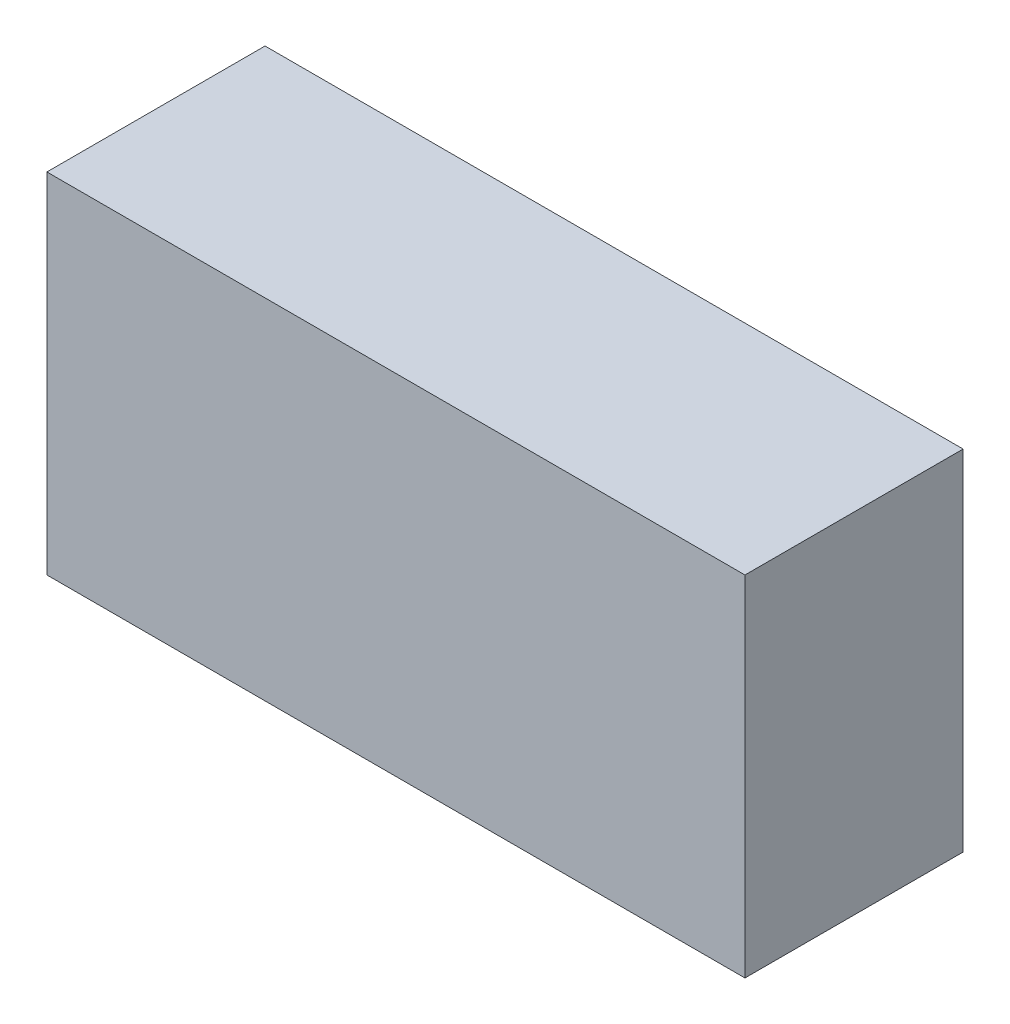
ISO-10303-21;
HEADER;
FILE_DESCRIPTION(('STEP AP214'),'2;1');
FILE_NAME('part.step','',(''),(''),'','','');
FILE_SCHEMA(('AUTOMOTIVE_DESIGN { 1 0 10303 214 1 1 1 1 }'));
ENDSEC;
DATA;
#1=APPLICATION_CONTEXT('core data for automotive mechanical design processes');
#2=APPLICATION_PROTOCOL_DEFINITION('international standard','automotive_design',2000,#1);
#3=PRODUCT_CONTEXT('',#1,'mechanical');
#4=PRODUCT('Part','Part','',(#3));
#5=PRODUCT_RELATED_PRODUCT_CATEGORY('part','',(#4));
#6=PRODUCT_DEFINITION_FORMATION('','',#4);
#7=PRODUCT_DEFINITION_CONTEXT('part definition',#1,'design');
#8=PRODUCT_DEFINITION('design','',#6,#7);
#9=PRODUCT_DEFINITION_SHAPE('','',#8);
#10=(LENGTH_UNIT() NAMED_UNIT(*) SI_UNIT(.MILLI.,.METRE.));
#11=(NAMED_UNIT(*) PLANE_ANGLE_UNIT() SI_UNIT($,.RADIAN.));
#12=(NAMED_UNIT(*) SI_UNIT($,.STERADIAN.) SOLID_ANGLE_UNIT());
#13=UNCERTAINTY_MEASURE_WITH_UNIT(LENGTH_MEASURE(1.E-05),#10,'distance_accuracy_value','');
#14=(GEOMETRIC_REPRESENTATION_CONTEXT(3) GLOBAL_UNCERTAINTY_ASSIGNED_CONTEXT((#13)) GLOBAL_UNIT_ASSIGNED_CONTEXT((#10,
#11,#12)) REPRESENTATION_CONTEXT('',''));
#15=CARTESIAN_POINT('',(0.,0.,0.));
#16=DIRECTION('',(0.,0.,1.));
#17=DIRECTION('',(1.,0.,0.));
#18=AXIS2_PLACEMENT_3D('',#15,#16,#17);
#19=CARTESIAN_POINT('',(0.80000094,-0.3999992,0.5));
#20=DIRECTION('',(0.,0.,-1.));
#21=DIRECTION('',(-1.,0.,0.));
#22=AXIS2_PLACEMENT_3D('',#19,#20,#21);
#23=PLANE('',#22);
#24=DIRECTION('',(1.,0.,0.));
#25=VECTOR('',#24,1.);
#26=CARTESIAN_POINT('',(0.80000094,0.3999992,0.5));
#27=LINE('',#26,#25);
#28=CARTESIAN_POINT('',(0.80000094,0.3999992,0.5));
#29=VERTEX_POINT('',#28);
#30=CARTESIAN_POINT('',(-0.80000094,0.3999992,0.5));
#31=VERTEX_POINT('',#30);
#32=EDGE_CURVE('E55',#29,#31,#27,.F.);
#33=ORIENTED_EDGE('',*,*,#32,.T.);
#34=DIRECTION('',(0.,1.,0.));
#35=VECTOR('',#34,1.);
#36=CARTESIAN_POINT('',(-0.80000094,0.3999992,0.5));
#37=LINE('',#36,#35);
#38=CARTESIAN_POINT('',(-0.80000094,-0.3999992,0.5));
#39=VERTEX_POINT('',#38);
#40=EDGE_CURVE('E58',#31,#39,#37,.F.);
#41=ORIENTED_EDGE('',*,*,#40,.T.);
#42=DIRECTION('',(1.,0.,0.));
#43=VECTOR('',#42,1.);
#44=CARTESIAN_POINT('',(-0.80000094,-0.3999992,0.5));
#45=LINE('',#44,#43);
#46=CARTESIAN_POINT('',(0.80000094,-0.3999992,0.5));
#47=VERTEX_POINT('',#46);
#48=EDGE_CURVE('E60',#39,#47,#45,.T.);
#49=ORIENTED_EDGE('',*,*,#48,.T.);
#50=DIRECTION('',(0.,1.,0.));
#51=VECTOR('',#50,1.);
#52=CARTESIAN_POINT('',(0.80000094,-0.3999992,0.5));
#53=LINE('',#52,#51);
#54=EDGE_CURVE('E20',#29,#47,#53,.F.);
#55=ORIENTED_EDGE('',*,*,#54,.F.);
#56=EDGE_LOOP('',(#33,#41,#49,#55));
#57=FACE_BOUND('',#56,.T.);
#58=ADVANCED_FACE('F17',(#57),#23,.F.);
#59=CARTESIAN_POINT('',(-0.80000094,-0.3999992,0.));
#60=DIRECTION('',(0.,1.,0.));
#61=DIRECTION('',(0.,0.,1.));
#62=AXIS2_PLACEMENT_3D('',#59,#60,#61);
#63=PLANE('',#62);
#64=DIRECTION('',(0.,0.,1.));
#65=VECTOR('',#64,1.);
#66=CARTESIAN_POINT('',(0.80000094,-0.3999992,0.));
#67=LINE('',#66,#65);
#68=CARTESIAN_POINT('',(0.80000094,-0.3999992,0.));
#69=VERTEX_POINT('',#68);
#70=EDGE_CURVE('E71',#69,#47,#67,.T.);
#71=ORIENTED_EDGE('',*,*,#70,.T.);
#72=ORIENTED_EDGE('',*,*,#48,.F.);
#73=DIRECTION('',(0.,0.,-1.));
#74=VECTOR('',#73,1.);
#75=CARTESIAN_POINT('',(-0.80000094,-0.3999992,0.));
#76=LINE('',#75,#74);
#77=CARTESIAN_POINT('',(-0.80000094,-0.3999992,0.));
#78=VERTEX_POINT('',#77);
#79=EDGE_CURVE('E65',#39,#78,#76,.T.);
#80=ORIENTED_EDGE('',*,*,#79,.T.);
#81=DIRECTION('',(-1.,0.,0.));
#82=VECTOR('',#81,1.);
#83=CARTESIAN_POINT('',(0.80000094,-0.3999992,0.));
#84=LINE('',#83,#82);
#85=EDGE_CURVE('E83',#69,#78,#84,.T.);
#86=ORIENTED_EDGE('',*,*,#85,.F.);
#87=EDGE_LOOP('',(#71,#72,#80,#86));
#88=FACE_BOUND('',#87,.T.);
#89=ADVANCED_FACE('F68',(#88),#63,.F.);
#90=CARTESIAN_POINT('',(-0.80000094,0.3999992,0.));
#91=DIRECTION('',(1.,0.,0.));
#92=DIRECTION('',(0.,0.,-1.));
#93=AXIS2_PLACEMENT_3D('',#90,#91,#92);
#94=PLANE('',#93);
#95=ORIENTED_EDGE('',*,*,#79,.F.);
#96=ORIENTED_EDGE('',*,*,#40,.F.);
#97=DIRECTION('',(0.,0.,-1.));
#98=VECTOR('',#97,1.);
#99=CARTESIAN_POINT('',(-0.80000094,0.3999992,0.));
#100=LINE('',#99,#98);
#101=CARTESIAN_POINT('',(-0.80000094,0.3999992,0.));
#102=VERTEX_POINT('',#101);
#103=EDGE_CURVE('E77',#31,#102,#100,.T.);
#104=ORIENTED_EDGE('',*,*,#103,.T.);
#105=DIRECTION('',(0.,1.,0.));
#106=VECTOR('',#105,1.);
#107=CARTESIAN_POINT('',(-0.80000094,-0.3999992,0.));
#108=LINE('',#107,#106);
#109=EDGE_CURVE('E74',#78,#102,#108,.T.);
#110=ORIENTED_EDGE('',*,*,#109,.F.);
#111=EDGE_LOOP('',(#95,#96,#104,#110));
#112=FACE_BOUND('',#111,.T.);
#113=ADVANCED_FACE('F72',(#112),#94,.F.);
#114=CARTESIAN_POINT('',(0.80000094,0.3999992,0.));
#115=DIRECTION('',(0.,-1.,0.));
#116=DIRECTION('',(0.,0.,-1.));
#117=AXIS2_PLACEMENT_3D('',#114,#115,#116);
#118=PLANE('',#117);
#119=ORIENTED_EDGE('',*,*,#103,.F.);
#120=ORIENTED_EDGE('',*,*,#32,.F.);
#121=DIRECTION('',(0.,0.,1.));
#122=VECTOR('',#121,1.);
#123=CARTESIAN_POINT('',(0.80000094,0.3999992,0.));
#124=LINE('',#123,#122);
#125=CARTESIAN_POINT('',(0.80000094,0.3999992,0.));
#126=VERTEX_POINT('',#125);
#127=EDGE_CURVE('E35',#29,#126,#124,.F.);
#128=ORIENTED_EDGE('',*,*,#127,.T.);
#129=DIRECTION('',(-1.,0.,0.));
#130=VECTOR('',#129,1.);
#131=CARTESIAN_POINT('',(0.80000094,0.3999992,0.));
#132=LINE('',#131,#130);
#133=EDGE_CURVE('E26',#102,#126,#132,.F.);
#134=ORIENTED_EDGE('',*,*,#133,.F.);
#135=EDGE_LOOP('',(#119,#120,#128,#134));
#136=FACE_BOUND('',#135,.T.);
#137=ADVANCED_FACE('F89',(#136),#118,.F.);
#138=CARTESIAN_POINT('',(0.80000094,-0.3999992,0.));
#139=DIRECTION('',(-1.,0.,0.));
#140=DIRECTION('',(0.,0.,1.));
#141=AXIS2_PLACEMENT_3D('',#138,#139,#140);
#142=PLANE('',#141);
#143=ORIENTED_EDGE('',*,*,#127,.F.);
#144=ORIENTED_EDGE('',*,*,#54,.T.);
#145=ORIENTED_EDGE('',*,*,#70,.F.);
#146=DIRECTION('',(0.,1.,0.));
#147=VECTOR('',#146,1.);
#148=CARTESIAN_POINT('',(0.80000094,-0.3999992,0.));
#149=LINE('',#148,#147);
#150=EDGE_CURVE('E11',#126,#69,#149,.F.);
#151=ORIENTED_EDGE('',*,*,#150,.F.);
#152=EDGE_LOOP('',(#143,#144,#145,#151));
#153=FACE_BOUND('',#152,.T.);
#154=ADVANCED_FACE('F91',(#153),#142,.F.);
#155=CARTESIAN_POINT('',(0.80000094,-0.3999992,0.));
#156=DIRECTION('',(0.,0.,-1.));
#157=DIRECTION('',(-1.,0.,0.));
#158=AXIS2_PLACEMENT_3D('',#155,#156,#157);
#159=PLANE('',#158);
#160=ORIENTED_EDGE('',*,*,#133,.T.);
#161=ORIENTED_EDGE('',*,*,#150,.T.);
#162=ORIENTED_EDGE('',*,*,#85,.T.);
#163=ORIENTED_EDGE('',*,*,#109,.T.);
#164=EDGE_LOOP('',(#160,#161,#162,#163));
#165=FACE_BOUND('',#164,.T.);
#166=ADVANCED_FACE('F88',(#165),#159,.T.);
#167=CLOSED_SHELL('',(#58,#89,#113,#137,#154,#166));
#168=MANIFOLD_SOLID_BREP('B1',#167);
#169=ADVANCED_BREP_SHAPE_REPRESENTATION('',(#18,#168),#14);
#170=SHAPE_DEFINITION_REPRESENTATION(#9,#169);
ENDSEC;
END-ISO-10303-21;
